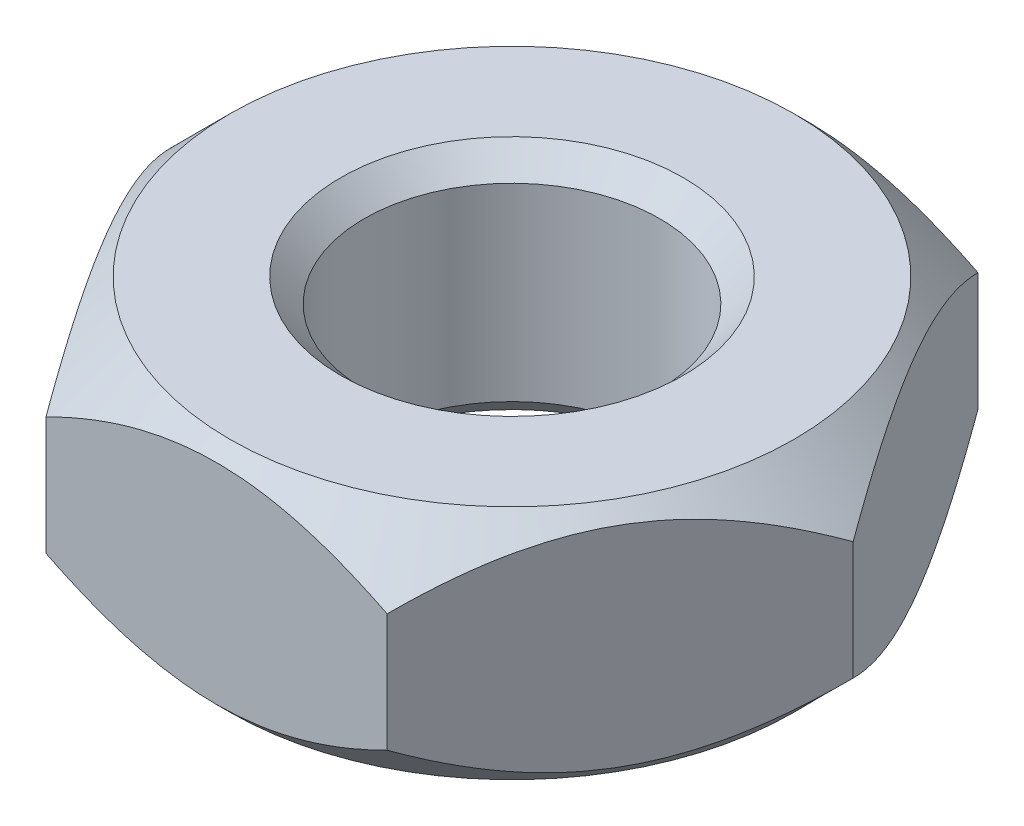
ISO-10303-21;
HEADER;
FILE_DESCRIPTION(('STEP AP214'),'2;1');
FILE_NAME('part.step','',(''),(''),'','','');
FILE_SCHEMA(('AUTOMOTIVE_DESIGN { 1 0 10303 214 1 1 1 1 }'));
ENDSEC;
DATA;
#1=APPLICATION_CONTEXT('core data for automotive mechanical design processes');
#2=APPLICATION_PROTOCOL_DEFINITION('international standard','automotive_design',2000,#1);
#3=PRODUCT_CONTEXT('',#1,'mechanical');
#4=PRODUCT('Part','Part','',(#3));
#5=PRODUCT_RELATED_PRODUCT_CATEGORY('part','',(#4));
#6=PRODUCT_DEFINITION_FORMATION('','',#4);
#7=PRODUCT_DEFINITION_CONTEXT('part definition',#1,'design');
#8=PRODUCT_DEFINITION('design','',#6,#7);
#9=PRODUCT_DEFINITION_SHAPE('','',#8);
#10=(LENGTH_UNIT() NAMED_UNIT(*) SI_UNIT(.MILLI.,.METRE.));
#11=(NAMED_UNIT(*) PLANE_ANGLE_UNIT() SI_UNIT($,.RADIAN.));
#12=(NAMED_UNIT(*) SI_UNIT($,.STERADIAN.) SOLID_ANGLE_UNIT());
#13=UNCERTAINTY_MEASURE_WITH_UNIT(LENGTH_MEASURE(1.E-05),#10,'distance_accuracy_value','');
#14=(GEOMETRIC_REPRESENTATION_CONTEXT(3) GLOBAL_UNCERTAINTY_ASSIGNED_CONTEXT((#13)) GLOBAL_UNIT_ASSIGNED_CONTEXT((#10,
#11,#12)) REPRESENTATION_CONTEXT('',''));
#15=CARTESIAN_POINT('',(0.,0.,0.));
#16=DIRECTION('',(0.,0.,1.));
#17=DIRECTION('',(1.,0.,0.));
#18=AXIS2_PLACEMENT_3D('',#15,#16,#17);
#19=CARTESIAN_POINT('',(-2.88675134594814,-2.,0.));
#20=DIRECTION('',(-0.86602540378444,0.,-0.499999999999998));
#21=DIRECTION('',(-0.499999999999998,0.,0.86602540378444));
#22=AXIS2_PLACEMENT_3D('',#19,#20,#21);
#23=PLANE('',#22);
#24=CARTESIAN_POINT('',(-2.88686681600197,-1.49988452301824,0.000200000000016922));
#25=CARTESIAN_POINT('',(-2.83725032818751,-1.54945929464527,-0.0857382777877483));
#26=CARTESIAN_POINT('',(-2.7868041812811,-1.59612251863749,-0.173113567275737));
#27=CARTESIAN_POINT('',(-2.68393890266961,-1.6815618599617,-0.351281456165573));
#28=CARTESIAN_POINT('',(-2.63150998769861,-1.720290437594,-0.44209100068106));
#29=CARTESIAN_POINT('',(-2.52578957716234,-1.78663329610227,-0.625204123126907));
#30=CARTESIAN_POINT('',(-2.47252500720905,-1.81441433146915,-0.717461064529327));
#31=CARTESIAN_POINT('',(-2.36482323343211,-1.85721682408934,-0.904006008776274));
#32=CARTESIAN_POINT('',(-2.31038931995913,-1.87227023332866,-0.998288312566272));
#33=CARTESIAN_POINT('',(-2.21657570605387,-1.88585227779052,-1.16077825829183));
#34=CARTESIAN_POINT('',(-2.17731721011879,-1.8878629007592,-1.22877596788014));
#35=CARTESIAN_POINT('',(-2.09886438835671,-1.88447588281252,-1.36466024116921));
#36=CARTESIAN_POINT('',(-2.05967008984863,-1.87907564470019,-1.43254675755223));
#37=CARTESIAN_POINT('',(-1.98165157555716,-1.86117421159754,-1.56767878823609));
#38=CARTESIAN_POINT('',(-1.94282782326098,-1.84866507295353,-1.63492349975355));
#39=CARTESIAN_POINT('',(-1.86585167424617,-1.8172324980443,-1.76825010081819));
#40=CARTESIAN_POINT('',(-1.82769922629679,-1.79830955350319,-1.83433207909964));
#41=CARTESIAN_POINT('',(-1.72997445583859,-1.74213263859176,-2.00359634669125));
#42=CARTESIAN_POINT('',(-1.67100807039232,-1.70064416840382,-2.10572912222288));
#43=CARTESIAN_POINT('',(-1.58430317001563,-1.63060595327692,-2.2559064149405));
#44=CARTESIAN_POINT('',(-1.55573003305808,-1.60599774788393,-2.30539653988261));
#45=CARTESIAN_POINT('',(-1.49911303110426,-1.55453811328477,-2.40346006383884));
#46=CARTESIAN_POINT('',(-1.47106885396707,-1.52768806122065,-2.45203400349693));
#47=CARTESIAN_POINT('',(-1.44326020292023,-1.49988452301824,-2.5002));
#48=B_SPLINE_CURVE_WITH_KNOTS('',3,(#24,#25,#26,#27,#28,#29,#30,#31,#32,#33,#34,#35,#36,#37,#38,
#39,#40,#41,#42,#43,#44,#45,#46,#47),.UNSPECIFIED.,.F.,.F.,(4,2,2,2,2,2,2,2,2,2,2,4),(0.,
0.333012085133926,0.6679645183014,0.997597032043304,1.32639954393845,1.56169424147169,
1.79707142102083,2.03271213522171,2.26833478775651,2.64260240809534,2.82922877818865,
3.01574133749027),.UNSPECIFIED.);
#49=CARTESIAN_POINT('',(-2.88675134594814,-1.5,0.));
#50=VERTEX_POINT('',#49);
#51=CARTESIAN_POINT('',(-1.44337567297408,-1.5,-2.5));
#52=VERTEX_POINT('',#51);
#53=EDGE_CURVE('E153',#50,#52,#48,.T.);
#54=ORIENTED_EDGE('',*,*,#53,.F.);
#55=DIRECTION('',(0.,1.,0.));
#56=VECTOR('',#55,1.);
#57=CARTESIAN_POINT('',(-2.88675134594814,-2.,0.));
#58=LINE('',#57,#56);
#59=CARTESIAN_POINT('',(-2.88675134594814,-0.5,0.));
#60=VERTEX_POINT('',#59);
#61=EDGE_CURVE('E52',#50,#60,#58,.T.);
#62=ORIENTED_EDGE('',*,*,#61,.T.);
#63=CARTESIAN_POINT('',(-1.44326020292023,-0.50011547698176,-2.5002));
#64=CARTESIAN_POINT('',(-1.49287669073469,-0.450540705354723,-2.41426172221224));
#65=CARTESIAN_POINT('',(-1.5433228376411,-0.403877481362501,-2.32688643272425));
#66=CARTESIAN_POINT('',(-1.64618811625259,-0.318438140038296,-2.14871854383441));
#67=CARTESIAN_POINT('',(-1.6986170312236,-0.279709562405997,-2.05790899931892));
#68=CARTESIAN_POINT('',(-1.80433744175986,-0.213366703897733,-1.87479587687308));
#69=CARTESIAN_POINT('',(-1.85760201171316,-0.185585668530851,-1.78253893547066));
#70=CARTESIAN_POINT('',(-1.9653037854901,-0.14278317591066,-1.59599399122371));
#71=CARTESIAN_POINT('',(-2.01973769896307,-0.127729766671338,-1.50171168743372));
#72=CARTESIAN_POINT('',(-2.11355131286833,-0.114147722209475,-1.33922174170815));
#73=CARTESIAN_POINT('',(-2.15280980880341,-0.112137099240795,-1.27122403211985));
#74=CARTESIAN_POINT('',(-2.23126263056549,-0.115524117187482,-1.13533975883078));
#75=CARTESIAN_POINT('',(-2.27045692907358,-0.120924355299814,-1.06745324244776));
#76=CARTESIAN_POINT('',(-2.34847544336505,-0.138825788402465,-0.932321211763894));
#77=CARTESIAN_POINT('',(-2.38729919566123,-0.151334927046473,-0.865076500246439));
#78=CARTESIAN_POINT('',(-2.46427534467603,-0.182767501955699,-0.731749899181801));
#79=CARTESIAN_POINT('',(-2.50242779262542,-0.201690446496811,-0.665667920900343));
#80=CARTESIAN_POINT('',(-2.60015256308362,-0.25786736140824,-0.496403653308732));
#81=CARTESIAN_POINT('',(-2.65911894852989,-0.299355831596181,-0.394270877777102));
#82=CARTESIAN_POINT('',(-2.74582384890657,-0.369394046723084,-0.244093585059482));
#83=CARTESIAN_POINT('',(-2.77439698586412,-0.39400225211607,-0.19460346011738));
#84=CARTESIAN_POINT('',(-2.83101398781794,-0.445461886715234,-0.0965399361611392));
#85=CARTESIAN_POINT('',(-2.85905816495514,-0.472311938779355,-0.0479659965030565));
#86=CARTESIAN_POINT('',(-2.88686681600197,-0.500115476981764,0.00020000000001703));
#87=B_SPLINE_CURVE_WITH_KNOTS('',3,(#63,#64,#65,#66,#67,#68,#69,#70,#71,#72,#73,#74,#75,#76,#77,
#78,#79,#80,#81,#82,#83,#84,#85,#86),.UNSPECIFIED.,.F.,.F.,(4,2,2,2,2,2,2,2,2,2,2,4),(0.,
0.333012085133924,0.667964518301398,0.9975970320433,1.32639954393844,1.56169424147169,
1.79707142102083,2.03271213522171,2.2683347877565,2.64260240809534,2.82922877818865,
3.01574133749027),.UNSPECIFIED.);
#88=CARTESIAN_POINT('',(-1.44337567297408,-0.5,-2.5));
#89=VERTEX_POINT('',#88);
#90=EDGE_CURVE('E112',#89,#60,#87,.T.);
#91=ORIENTED_EDGE('',*,*,#90,.F.);
#92=DIRECTION('',(0.,1.,0.));
#93=VECTOR('',#92,1.);
#94=CARTESIAN_POINT('',(-1.44337567297407,-2.,-2.5));
#95=LINE('',#94,#93);
#96=EDGE_CURVE('E117',#52,#89,#95,.T.);
#97=ORIENTED_EDGE('',*,*,#96,.F.);
#98=EDGE_LOOP('',(#54,#62,#91,#97));
#99=FACE_BOUND('',#98,.T.);
#100=ADVANCED_FACE('F29',(#99),#23,.T.);
#101=CARTESIAN_POINT('',(-1.44337567297407,-2.,-2.5));
#102=DIRECTION('',(0.,0.,-1.));
#103=DIRECTION('',(-1.,0.,0.));
#104=AXIS2_PLACEMENT_3D('',#101,#102,#103);
#105=PLANE('',#104);
#106=CARTESIAN_POINT('',(-2.96668433955213,-0.50716168072014,-2.5));
#107=CARTESIAN_POINT('',(-2.8948317096725,-0.562094291020301,-2.5));
#108=CARTESIAN_POINT('',(-2.82258679707706,-0.616521949176977,-2.5));
#109=CARTESIAN_POINT('',(-2.67715393829106,-0.724138208465676,-2.5));
#110=CARTESIAN_POINT('',(-2.60396576868744,-0.777326507352796,-2.5));
#111=CARTESIAN_POINT('',(-2.45595268046653,-0.882613460257373,-2.5));
#112=CARTESIAN_POINT('',(-2.38111948346967,-0.93470051499951,-2.5));
#113=CARTESIAN_POINT('',(-2.2301989653448,-1.03701874636586,-2.5));
#114=CARTESIAN_POINT('',(-2.15411173180744,-1.08725005182076,-2.5));
#115=CARTESIAN_POINT('',(-1.9957576137183,-1.18845284780402,-2.5));
#116=CARTESIAN_POINT('',(-1.91339821044008,-1.23928030245024,-2.5));
#117=CARTESIAN_POINT('',(-1.74677292530007,-1.33770298399123,-2.5));
#118=CARTESIAN_POINT('',(-1.6625072948511,-1.38529863385422,-2.5));
#119=CARTESIAN_POINT('',(-1.49202090628762,-1.4762629104708,-2.5));
#120=CARTESIAN_POINT('',(-1.4058065139511,-1.51964337466806,-2.5));
#121=CARTESIAN_POINT('',(-1.23096887512707,-1.60119760358206,-2.5));
#122=CARTESIAN_POINT('',(-1.14234677306194,-1.63937379178838,-2.5));
#123=CARTESIAN_POINT('',(-0.970857842618479,-1.70590877597029,-2.5));
#124=CARTESIAN_POINT('',(-0.888219170351425,-1.73484961454076,-2.5));
#125=CARTESIAN_POINT('',(-0.720875298126575,-1.78611226326244,-2.5));
#126=CARTESIAN_POINT('',(-0.63616996352977,-1.80843364091585,-2.5));
#127=CARTESIAN_POINT('',(-0.466650942448528,-1.84489217896014,-2.5));
#128=CARTESIAN_POINT('',(-0.381869134653481,-1.85917509778603,-2.5));
#129=CARTESIAN_POINT('',(-0.211301742264057,-1.87926536158531,-2.5));
#130=CARTESIAN_POINT('',(-0.12551635652182,-1.8850743578689,-2.5));
#131=CARTESIAN_POINT('',(0.0426703656744015,-1.88774325465857,-2.5));
#132=CARTESIAN_POINT('',(0.125066107632572,-1.88496061689089,-2.5));
#133=CARTESIAN_POINT('',(0.289193381610066,-1.87141033229845,-2.5));
#134=CARTESIAN_POINT('',(0.370924851074756,-1.86064194206392,-2.5));
#135=CARTESIAN_POINT('',(0.534518605306853,-1.83153951160601,-2.5));
#136=CARTESIAN_POINT('',(0.616357066153045,-1.81307355324132,-2.5));
#137=CARTESIAN_POINT('',(0.778230408567287,-1.76958390685987,-2.5));
#138=CARTESIAN_POINT('',(0.858265409015181,-1.74456065246594,-2.5));
#139=CARTESIAN_POINT('',(1.10640142051369,-1.65746767285976,-2.5));
#140=CARTESIAN_POINT('',(1.27108970475707,-1.58564168301095,-2.5));
#141=CARTESIAN_POINT('',(1.51211013995076,-1.46585710596878,-2.5));
#142=CARTESIAN_POINT('',(1.59159684007466,-1.42382785957348,-2.5));
#143=CARTESIAN_POINT('',(1.74876895904319,-1.3365189493186,-2.5));
#144=CARTESIAN_POINT('',(1.82645469386736,-1.29123986144223,-2.5));
#145=CARTESIAN_POINT('',(1.97643122124162,-1.20038955470845,-2.5));
#146=CARTESIAN_POINT('',(2.04879877304284,-1.15494361847622,-2.5));
#147=CARTESIAN_POINT('',(2.19229239644035,-1.06212297540419,-2.5));
#148=CARTESIAN_POINT('',(2.26341837406328,-1.01474812346353,-2.5));
#149=CARTESIAN_POINT('',(2.40401606758878,-0.918802509104789,-2.5));
#150=CARTESIAN_POINT('',(2.47349649538698,-0.870244460069756,-2.5));
#151=CARTESIAN_POINT('',(2.6115052188232,-0.771831837624504,-2.5));
#152=CARTESIAN_POINT('',(2.6800337715094,-0.72197762510584,-2.5));
#153=CARTESIAN_POINT('',(2.74816343524428,-0.671592901572763,-2.5));
#154=B_SPLINE_CURVE_WITH_KNOTS('',3,(#106,#107,#108,#109,#110,#111,#112,#113,#114,#115,#116,
#117,#118,#119,#120,#121,#122,#123,#124,#125,#126,#127,#128,#129,#130,#131,#132,#133,#134,#135,
#136,#137,#138,#139,#140,#141,#142,#143,#144,#145,#146,#147,#148,#149,#150,#151,#152,#153),
.UNSPECIFIED.,.F.,.F.,(4,2,2,2,2,2,2,2,2,2,2,2,2,2,2,2,2,2,2,2,2,2,2,4),(0.,0.271341667855833,
0.542748830046722,0.816253709161615,1.08973956507595,1.38002315639178,1.67026868280413,
1.95967401363601,2.24894411253436,2.51139576932094,2.77386457021757,3.0314066607157,
3.28889855737335,3.53582375183444,3.78277193594476,4.03413854269895,4.28548853120069,
4.82282938730673,5.09254998785806,5.36222290216635,5.61855395261542,5.87490432107986,
6.12918893681202,6.38340349453403),.UNSPECIFIED.);
#155=CARTESIAN_POINT('',(1.44337567297408,-1.5,-2.5));
#156=VERTEX_POINT('',#155);
#157=EDGE_CURVE('E158',#52,#156,#154,.T.);
#158=ORIENTED_EDGE('',*,*,#157,.F.);
#159=ORIENTED_EDGE('',*,*,#96,.T.);
#160=CARTESIAN_POINT('',(-2.96668433955213,-1.49283831927986,-2.5));
#161=CARTESIAN_POINT('',(-2.8948317096725,-1.4379057089797,-2.5));
#162=CARTESIAN_POINT('',(-2.82258679707706,-1.38347805082302,-2.5));
#163=CARTESIAN_POINT('',(-2.67715393829106,-1.27586179153432,-2.5));
#164=CARTESIAN_POINT('',(-2.60396576868744,-1.2226734926472,-2.5));
#165=CARTESIAN_POINT('',(-2.45595268046653,-1.11738653974263,-2.5));
#166=CARTESIAN_POINT('',(-2.38111948346967,-1.06529948500049,-2.5));
#167=CARTESIAN_POINT('',(-2.2301989653448,-0.962981253634143,-2.5));
#168=CARTESIAN_POINT('',(-2.15411173180744,-0.91274994817924,-2.5));
#169=CARTESIAN_POINT('',(-1.9957576137183,-0.811547152195981,-2.5));
#170=CARTESIAN_POINT('',(-1.91339821044008,-0.76071969754976,-2.5));
#171=CARTESIAN_POINT('',(-1.74677292530007,-0.662297016008771,-2.5));
#172=CARTESIAN_POINT('',(-1.6625072948511,-0.61470136614578,-2.5));
#173=CARTESIAN_POINT('',(-1.49202090628762,-0.523737089529204,-2.5));
#174=CARTESIAN_POINT('',(-1.4058065139511,-0.480356625331944,-2.5));
#175=CARTESIAN_POINT('',(-1.23096887512707,-0.398802396417942,-2.5));
#176=CARTESIAN_POINT('',(-1.14234677306194,-0.36062620821162,-2.5));
#177=CARTESIAN_POINT('',(-0.970857842618479,-0.29409122402971,-2.5));
#178=CARTESIAN_POINT('',(-0.888219170351425,-0.265150385459239,-2.5));
#179=CARTESIAN_POINT('',(-0.720875298126575,-0.213887736737561,-2.5));
#180=CARTESIAN_POINT('',(-0.63616996352977,-0.191566359084148,-2.5));
#181=CARTESIAN_POINT('',(-0.466650942448528,-0.155107821039862,-2.5));
#182=CARTESIAN_POINT('',(-0.38186913465348,-0.140824902213974,-2.5));
#183=CARTESIAN_POINT('',(-0.211301742264056,-0.12073463841469,-2.5));
#184=CARTESIAN_POINT('',(-0.125516356521819,-0.114925642131103,-2.5));
#185=CARTESIAN_POINT('',(0.0426703656744026,-0.112256745341427,-2.5));
#186=CARTESIAN_POINT('',(0.125066107632573,-0.115039383109113,-2.5));
#187=CARTESIAN_POINT('',(0.289193381610067,-0.128589667701554,-2.5));
#188=CARTESIAN_POINT('',(0.370924851074757,-0.139358057936075,-2.5));
#189=CARTESIAN_POINT('',(0.534518605306854,-0.168460488393988,-2.5));
#190=CARTESIAN_POINT('',(0.616357066153047,-0.186926446758684,-2.5));
#191=CARTESIAN_POINT('',(0.778230408567288,-0.230416093140128,-2.5));
#192=CARTESIAN_POINT('',(0.858265409015182,-0.255439347534065,-2.5));
#193=CARTESIAN_POINT('',(1.10640142051369,-0.342532327140244,-2.5));
#194=CARTESIAN_POINT('',(1.27108970475708,-0.414358316989049,-2.5));
#195=CARTESIAN_POINT('',(1.51211013995076,-0.534142894031226,-2.5));
#196=CARTESIAN_POINT('',(1.59159684007467,-0.576172140426518,-2.5));
#197=CARTESIAN_POINT('',(1.74876895904319,-0.663481050681403,-2.5));
#198=CARTESIAN_POINT('',(1.82645469386736,-0.708760138557776,-2.5));
#199=CARTESIAN_POINT('',(1.97643122124163,-0.799610445291555,-2.5));
#200=CARTESIAN_POINT('',(2.04879877304285,-0.845056381523783,-2.5));
#201=CARTESIAN_POINT('',(2.19229239644036,-0.937877024595809,-2.5));
#202=CARTESIAN_POINT('',(2.26341837406328,-0.98525187653647,-2.5));
#203=CARTESIAN_POINT('',(2.40401606758878,-1.08119749089521,-2.5));
#204=CARTESIAN_POINT('',(2.47349649538698,-1.12975553993025,-2.5));
#205=CARTESIAN_POINT('',(2.61150521882321,-1.2281681623755,-2.5));
#206=CARTESIAN_POINT('',(2.6800337715094,-1.27802237489416,-2.5));
#207=CARTESIAN_POINT('',(2.74816343524428,-1.32840709842724,-2.5));
#208=B_SPLINE_CURVE_WITH_KNOTS('',3,(#160,#161,#162,#163,#164,#165,#166,#167,#168,#169,#170,
#171,#172,#173,#174,#175,#176,#177,#178,#179,#180,#181,#182,#183,#184,#185,#186,#187,#188,#189,
#190,#191,#192,#193,#194,#195,#196,#197,#198,#199,#200,#201,#202,#203,#204,#205,#206,#207),
.UNSPECIFIED.,.F.,.F.,(4,2,2,2,2,2,2,2,2,2,2,2,2,2,2,2,2,2,2,2,2,2,2,4),(0.,0.271341667855833,
0.542748830046723,0.816253709161615,1.08973956507595,1.38002315639178,1.67026868280413,
1.95967401363601,2.24894411253436,2.51139576932094,2.77386457021757,3.0314066607157,
3.28889855737335,3.53582375183444,3.78277193594476,4.03413854269895,4.28548853120069,
4.82282938730673,5.09254998785806,5.36222290216635,5.61855395261542,5.87490432107986,
6.12918893681203,6.38340349453404),.UNSPECIFIED.);
#209=CARTESIAN_POINT('',(1.44337567297408,-0.5,-2.5));
#210=VERTEX_POINT('',#209);
#211=EDGE_CURVE('E198',#210,#89,#208,.F.);
#212=ORIENTED_EDGE('',*,*,#211,.F.);
#213=DIRECTION('',(0.,1.,0.));
#214=VECTOR('',#213,1.);
#215=CARTESIAN_POINT('',(1.44337567297408,-2.,-2.5));
#216=LINE('',#215,#214);
#217=EDGE_CURVE('E106',#156,#210,#216,.T.);
#218=ORIENTED_EDGE('',*,*,#217,.F.);
#219=EDGE_LOOP('',(#158,#159,#212,#218));
#220=FACE_BOUND('',#219,.T.);
#221=ADVANCED_FACE('F208',(#220),#105,.T.);
#222=CARTESIAN_POINT('',(1.44337567297408,-2.,-2.5));
#223=DIRECTION('',(0.866025403784441,0.,-0.499999999999997));
#224=DIRECTION('',(-0.499999999999997,0.,-0.866025403784441));
#225=AXIS2_PLACEMENT_3D('',#222,#223,#224);
#226=PLANE('',#225);
#227=CARTESIAN_POINT('',(1.44326020292024,-1.49988452301823,-2.5002));
#228=CARTESIAN_POINT('',(1.4928766907347,-1.54945929464527,-2.41426172221224));
#229=CARTESIAN_POINT('',(1.54332283764111,-1.59612251863749,-2.32688643272425));
#230=CARTESIAN_POINT('',(1.6461881162526,-1.6815618599617,-2.14871854383441));
#231=CARTESIAN_POINT('',(1.6986170312236,-1.720290437594,-2.05790899931893));
#232=CARTESIAN_POINT('',(1.80433744175987,-1.78663329610226,-1.87479587687308));
#233=CARTESIAN_POINT('',(1.85760201171316,-1.81441433146914,-1.78253893547066));
#234=CARTESIAN_POINT('',(1.9653037854901,-1.85721682408934,-1.59599399122371));
#235=CARTESIAN_POINT('',(2.01973769896307,-1.87227023332866,-1.50171168743372));
#236=CARTESIAN_POINT('',(2.11355131286833,-1.88585227779052,-1.33922174170815));
#237=CARTESIAN_POINT('',(2.15280980880342,-1.8878629007592,-1.27122403211985));
#238=CARTESIAN_POINT('',(2.2312626305655,-1.88447588281251,-1.13533975883078));
#239=CARTESIAN_POINT('',(2.27045692907358,-1.87907564470018,-1.06745324244776));
#240=CARTESIAN_POINT('',(2.34847544336505,-1.86117421159753,-0.932321211763894));
#241=CARTESIAN_POINT('',(2.38729919566123,-1.84866507295352,-0.865076500246439));
#242=CARTESIAN_POINT('',(2.46427534467604,-1.8172324980443,-0.731749899181801));
#243=CARTESIAN_POINT('',(2.50242779262542,-1.79830955350319,-0.665667920900343));
#244=CARTESIAN_POINT('',(2.60015256308362,-1.74213263859176,-0.496403653308734));
#245=CARTESIAN_POINT('',(2.65911894852989,-1.70064416840382,-0.394270877777104));
#246=CARTESIAN_POINT('',(2.74582384890657,-1.63060595327692,-0.244093585059486));
#247=CARTESIAN_POINT('',(2.77439698586412,-1.60599774788393,-0.194603460117385));
#248=CARTESIAN_POINT('',(2.83101398781794,-1.55453811328477,-0.0965399361611462));
#249=CARTESIAN_POINT('',(2.85905816495514,-1.52768806122065,-0.0479659965030644));
#250=CARTESIAN_POINT('',(2.88686681600197,-1.49988452301824,0.000200000000008444));
#251=B_SPLINE_CURVE_WITH_KNOTS('',3,(#227,#228,#229,#230,#231,#232,#233,#234,#235,#236,#237,
#238,#239,#240,#241,#242,#243,#244,#245,#246,#247,#248,#249,#250),.UNSPECIFIED.,.F.,.F.,(4,2,2,
2,2,2,2,2,2,2,2,4),(0.,0.333012085133924,0.667964518301397,0.997597032043299,1.32639954393844,
1.56169424147169,1.79707142102083,2.03271213522171,2.2683347877565,2.64260240809533,
2.82922877818864,3.01574133749025),.UNSPECIFIED.);
#252=CARTESIAN_POINT('',(2.88675134594814,-1.5,0.));
#253=VERTEX_POINT('',#252);
#254=EDGE_CURVE('E86',#156,#253,#251,.T.);
#255=ORIENTED_EDGE('',*,*,#254,.F.);
#256=ORIENTED_EDGE('',*,*,#217,.T.);
#257=CARTESIAN_POINT('',(2.88686681600197,-0.500115476981762,0.000200000000008917));
#258=CARTESIAN_POINT('',(2.83725032818751,-0.450540705354725,-0.085738277787756));
#259=CARTESIAN_POINT('',(2.7868041812811,-0.403877481362504,-0.173113567275744));
#260=CARTESIAN_POINT('',(2.68393890266961,-0.318438140038299,-0.351281456165579));
#261=CARTESIAN_POINT('',(2.63150998769861,-0.279709562406,-0.442091000681066));
#262=CARTESIAN_POINT('',(2.52578957716235,-0.213366703897736,-0.625204123126912));
#263=CARTESIAN_POINT('',(2.47252500720905,-0.185585668530854,-0.717461064529331));
#264=CARTESIAN_POINT('',(2.36482323343211,-0.142783175910664,-0.904006008776276));
#265=CARTESIAN_POINT('',(2.31038931995914,-0.127729766671342,-0.998288312566273));
#266=CARTESIAN_POINT('',(2.21657570605388,-0.11414772220948,-1.16077825829184));
#267=CARTESIAN_POINT('',(2.17731721011879,-0.112137099240799,-1.22877596788014));
#268=CARTESIAN_POINT('',(2.09886438835671,-0.115524117187486,-1.36466024116921));
#269=CARTESIAN_POINT('',(2.05967008984863,-0.120924355299818,-1.43254675755223));
#270=CARTESIAN_POINT('',(1.98165157555716,-0.138825788402469,-1.5676787882361));
#271=CARTESIAN_POINT('',(1.94282782326098,-0.151334927046478,-1.63492349975355));
#272=CARTESIAN_POINT('',(1.86585167424617,-0.182767501955704,-1.76825010081819));
#273=CARTESIAN_POINT('',(1.82769922629679,-0.201690446496815,-1.83433207909965));
#274=CARTESIAN_POINT('',(1.72997445583859,-0.257867361408244,-2.00359634669126));
#275=CARTESIAN_POINT('',(1.67100807039232,-0.299355831596184,-2.10572912222289));
#276=CARTESIAN_POINT('',(1.58430317001564,-0.369394046723086,-2.25590641494051));
#277=CARTESIAN_POINT('',(1.55573003305809,-0.394002252116073,-2.30539653988261));
#278=CARTESIAN_POINT('',(1.49911303110427,-0.445461886715235,-2.40346006383885));
#279=CARTESIAN_POINT('',(1.47106885396707,-0.472311938779356,-2.45203400349693));
#280=CARTESIAN_POINT('',(1.44326020292024,-0.500115476981764,-2.5002));
#281=B_SPLINE_CURVE_WITH_KNOTS('',3,(#257,#258,#259,#260,#261,#262,#263,#264,#265,#266,#267,
#268,#269,#270,#271,#272,#273,#274,#275,#276,#277,#278,#279,#280),.UNSPECIFIED.,.F.,.F.,(4,2,2,
2,2,2,2,2,2,2,2,4),(0.,0.333012085133923,0.667964518301396,0.997597032043296,1.32639954393844,
1.56169424147168,1.79707142102082,2.0327121352217,2.2683347877565,2.64260240809533,
2.82922877818864,3.01574133749025),.UNSPECIFIED.);
#282=CARTESIAN_POINT('',(2.88675134594814,-0.5,0.));
#283=VERTEX_POINT('',#282);
#284=EDGE_CURVE('E192',#283,#210,#281,.T.);
#285=ORIENTED_EDGE('',*,*,#284,.F.);
#286=DIRECTION('',(0.,1.,0.));
#287=VECTOR('',#286,1.);
#288=CARTESIAN_POINT('',(2.88675134594813,-2.,0.));
#289=LINE('',#288,#287);
#290=EDGE_CURVE('E104',#253,#283,#289,.T.);
#291=ORIENTED_EDGE('',*,*,#290,.F.);
#292=EDGE_LOOP('',(#255,#256,#285,#291));
#293=FACE_BOUND('',#292,.T.);
#294=ADVANCED_FACE('F212',(#293),#226,.T.);
#295=CARTESIAN_POINT('',(2.88675134594813,-2.,0.));
#296=DIRECTION('',(0.866025403784436,0.,0.500000000000005));
#297=DIRECTION('',(0.500000000000005,0.,-0.866025403784436));
#298=AXIS2_PLACEMENT_3D('',#295,#296,#297);
#299=PLANE('',#298);
#300=CARTESIAN_POINT('',(2.88686681600197,-1.49988452301824,-0.000199999999991391));
#301=CARTESIAN_POINT('',(2.83725032818751,-1.54945929464528,0.0857382777877732));
#302=CARTESIAN_POINT('',(2.7868041812811,-1.5961225186375,0.173113567275761));
#303=CARTESIAN_POINT('',(2.6839389026696,-1.6815618599617,0.351281456165597));
#304=CARTESIAN_POINT('',(2.6315099876986,-1.720290437594,0.442091000681082));
#305=CARTESIAN_POINT('',(2.52578957716234,-1.78663329610227,0.625204123126928));
#306=CARTESIAN_POINT('',(2.47252500720904,-1.81441433146915,0.717461064529348));
#307=CARTESIAN_POINT('',(2.3648232334321,-1.85721682408934,0.904006008776293));
#308=CARTESIAN_POINT('',(2.31038931995913,-1.87227023332866,0.99828831256629));
#309=CARTESIAN_POINT('',(2.21657570605386,-1.88585227779053,1.16077825829185));
#310=CARTESIAN_POINT('',(2.17731721011878,-1.88786290075921,1.22877596788016));
#311=CARTESIAN_POINT('',(2.0988643883567,-1.88447588281252,1.36466024116922));
#312=CARTESIAN_POINT('',(2.05967008984861,-1.87907564470019,1.43254675755224));
#313=CARTESIAN_POINT('',(1.98165157555714,-1.86117421159754,1.56767878823611));
#314=CARTESIAN_POINT('',(1.94282782326096,-1.84866507295353,1.63492349975356));
#315=CARTESIAN_POINT('',(1.86585167424615,-1.8172324980443,1.7682501008182));
#316=CARTESIAN_POINT('',(1.82769922629677,-1.79830955350319,1.83433207909966));
#317=CARTESIAN_POINT('',(1.72997445583857,-1.74213263859176,2.00359634669126));
#318=CARTESIAN_POINT('',(1.6710080703923,-1.70064416840382,2.10572912222289));
#319=CARTESIAN_POINT('',(1.58430317001561,-1.63060595327692,2.25590641494051));
#320=CARTESIAN_POINT('',(1.55573003305806,-1.60599774788394,2.30539653988261));
#321=CARTESIAN_POINT('',(1.49911303110425,-1.55453811328478,2.40346006383885));
#322=CARTESIAN_POINT('',(1.47106885396705,-1.52768806122065,2.45203400349693));
#323=CARTESIAN_POINT('',(1.44326020292022,-1.49988452301825,2.5002));
#324=B_SPLINE_CURVE_WITH_KNOTS('',3,(#300,#301,#302,#303,#304,#305,#306,#307,#308,#309,#310,
#311,#312,#313,#314,#315,#316,#317,#318,#319,#320,#321,#322,#323),.UNSPECIFIED.,.F.,.F.,(4,2,2,
2,2,2,2,2,2,2,2,4),(0.,0.333012085133925,0.667964518301399,0.997597032043302,1.32639954393845,
1.56169424147169,1.79707142102083,2.03271213522171,2.2683347877565,2.64260240809533,
2.82922877818864,3.01574133749025),.UNSPECIFIED.);
#325=CARTESIAN_POINT('',(1.44337567297408,-1.5,2.5));
#326=VERTEX_POINT('',#325);
#327=EDGE_CURVE('E82',#253,#326,#324,.T.);
#328=ORIENTED_EDGE('',*,*,#327,.F.);
#329=ORIENTED_EDGE('',*,*,#290,.T.);
#330=CARTESIAN_POINT('',(1.44326020292022,-0.500115476981753,2.5002));
#331=CARTESIAN_POINT('',(1.49287669073468,-0.450540705354716,2.41426172221224));
#332=CARTESIAN_POINT('',(1.54332283764109,-0.403877481362495,2.32688643272425));
#333=CARTESIAN_POINT('',(1.64618811625258,-0.318438140038292,2.14871854383442));
#334=CARTESIAN_POINT('',(1.69861703122358,-0.279709562405993,2.05790899931893));
#335=CARTESIAN_POINT('',(1.80433744175985,-0.21336670389773,1.87479587687309));
#336=CARTESIAN_POINT('',(1.85760201171315,-0.185585668530848,1.78253893547067));
#337=CARTESIAN_POINT('',(1.96530378549008,-0.142783175910658,1.59599399122373));
#338=CARTESIAN_POINT('',(2.01973769896306,-0.127729766671336,1.50171168743373));
#339=CARTESIAN_POINT('',(2.11355131286832,-0.114147722209474,1.33922174170817));
#340=CARTESIAN_POINT('',(2.1528098088034,-0.112137099240794,1.27122403211986));
#341=CARTESIAN_POINT('',(2.23126263056548,-0.115524117187481,1.1353397588308));
#342=CARTESIAN_POINT('',(2.27045692907357,-0.120924355299813,1.06745324244778));
#343=CARTESIAN_POINT('',(2.34847544336504,-0.138825788402464,0.932321211763912));
#344=CARTESIAN_POINT('',(2.38729919566122,-0.151334927046473,0.865076500246457));
#345=CARTESIAN_POINT('',(2.46427534467603,-0.182767501955699,0.73174989918182));
#346=CARTESIAN_POINT('',(2.50242779262541,-0.20169044649681,0.665667920900362));
#347=CARTESIAN_POINT('',(2.60015256308361,-0.257867361408239,0.496403653308753));
#348=CARTESIAN_POINT('',(2.65911894852988,-0.29935583159618,0.394270877777123));
#349=CARTESIAN_POINT('',(2.74582384890657,-0.369394046723083,0.244093585059504));
#350=CARTESIAN_POINT('',(2.77439698586412,-0.394002252116069,0.194603460117403));
#351=CARTESIAN_POINT('',(2.83101398781794,-0.445461886715232,0.0965399361611634));
#352=CARTESIAN_POINT('',(2.85905816495514,-0.472311938779353,0.0479659965030815));
#353=CARTESIAN_POINT('',(2.88686681600197,-0.500115476981762,-0.000199999999991508));
#354=B_SPLINE_CURVE_WITH_KNOTS('',3,(#330,#331,#332,#333,#334,#335,#336,#337,#338,#339,#340,
#341,#342,#343,#344,#345,#346,#347,#348,#349,#350,#351,#352,#353),.UNSPECIFIED.,.F.,.F.,(4,2,2,
2,2,2,2,2,2,2,2,4),(0.,0.333012085133921,0.667964518301392,0.997597032043291,1.32639954393843,
1.56169424147167,1.79707142102081,2.03271213522169,2.26833478775649,2.64260240809532,
2.82922877818863,3.01574133749025),.UNSPECIFIED.);
#355=CARTESIAN_POINT('',(1.44337567297408,-0.5,2.5));
#356=VERTEX_POINT('',#355);
#357=EDGE_CURVE('E103',#356,#283,#354,.T.);
#358=ORIENTED_EDGE('',*,*,#357,.F.);
#359=DIRECTION('',(0.,1.,0.));
#360=VECTOR('',#359,1.);
#361=CARTESIAN_POINT('',(1.44337567297405,-2.,2.5));
#362=LINE('',#361,#360);
#363=EDGE_CURVE('E95',#326,#356,#362,.T.);
#364=ORIENTED_EDGE('',*,*,#363,.F.);
#365=EDGE_LOOP('',(#328,#329,#358,#364));
#366=FACE_BOUND('',#365,.T.);
#367=ADVANCED_FACE('F101',(#366),#299,.T.);
#368=CARTESIAN_POINT('',(1.44337567297405,-2.,2.5));
#369=DIRECTION('',(0.,0.,1.));
#370=DIRECTION('',(1.,0.,0.));
#371=AXIS2_PLACEMENT_3D('',#368,#369,#370);
#372=PLANE('',#371);
#373=CARTESIAN_POINT('',(-2.96668433956989,-0.507161680706556,2.5));
#374=CARTESIAN_POINT('',(-2.89483170968975,-0.562094291007242,2.5));
#375=CARTESIAN_POINT('',(-2.8225867970938,-0.616521949164443,2.5));
#376=CARTESIAN_POINT('',(-2.67715393830678,-0.724138208454188,2.5));
#377=CARTESIAN_POINT('',(-2.60396576870264,-0.777326507341829,2.5));
#378=CARTESIAN_POINT('',(-2.45595268048069,-0.882613460247453,2.5));
#379=CARTESIAN_POINT('',(-2.38111948348329,-0.934700514990116,2.5));
#380=CARTESIAN_POINT('',(-2.23019896535735,-1.0370187463575,2.5));
#381=CARTESIAN_POINT('',(-2.15411173181945,-1.08725005181292,2.5));
#382=CARTESIAN_POINT('',(-1.99575761372914,-1.18845284779726,2.5));
#383=CARTESIAN_POINT('',(-1.91339821045029,-1.23928030244404,2.5));
#384=CARTESIAN_POINT('',(-1.74677292530901,-1.33770298398612,2.5));
#385=CARTESIAN_POINT('',(-1.66250729485939,-1.38529863384964,2.5));
#386=CARTESIAN_POINT('',(-1.49202090629458,-1.47626291046724,2.5));
#387=CARTESIAN_POINT('',(-1.40580651395739,-1.51964337466499,2.5));
#388=CARTESIAN_POINT('',(-1.23096887513197,-1.60119760357991,2.5));
#389=CARTESIAN_POINT('',(-1.14234677306613,-1.63937379178666,2.5));
#390=CARTESIAN_POINT('',(-0.97085784262237,-1.70590877596887,2.5));
#391=CARTESIAN_POINT('',(-0.888219170355759,-1.7348496145393,2.5));
#392=CARTESIAN_POINT('',(-0.72087529813181,-1.78611226326097,2.5));
#393=CARTESIAN_POINT('',(-0.636169963535464,-1.80843364091443,2.5));
#394=CARTESIAN_POINT('',(-0.466650942455125,-1.84489217895891,2.5));
#395=CARTESIAN_POINT('',(-0.381869134660522,-1.85917509778495,2.5));
#396=CARTESIAN_POINT('',(-0.211301742271974,-1.87926536158463,2.5));
#397=CARTESIAN_POINT('',(-0.125516356530169,-1.88507435786846,2.5));
#398=CARTESIAN_POINT('',(0.0426703656652969,-1.88774325465872,2.5));
#399=CARTESIAN_POINT('',(0.125066107623142,-1.88496061689135,2.5));
#400=CARTESIAN_POINT('',(0.289193381600021,-1.87141033229959,2.5));
#401=CARTESIAN_POINT('',(0.370924851064421,-1.86064194206544,2.5));
#402=CARTESIAN_POINT('',(0.534518605295945,-1.83153951160829,2.5));
#403=CARTESIAN_POINT('',(0.616357066141856,-1.81307355324399,2.5));
#404=CARTESIAN_POINT('',(0.778230408555563,-1.76958390686335,2.5));
#405=CARTESIAN_POINT('',(0.858265409003205,-1.74456065246982,2.5));
#406=CARTESIAN_POINT('',(1.10640142049915,-1.65746767286554,2.5));
#407=CARTESIAN_POINT('',(1.27108970474034,-1.58564168301848,2.5));
#408=CARTESIAN_POINT('',(1.51211013993088,-1.46585710597905,2.5));
#409=CARTESIAN_POINT('',(1.59159684005376,-1.4238278595847,2.5));
#410=CARTESIAN_POINT('',(1.74876895902025,-1.33651894933174,2.5));
#411=CARTESIAN_POINT('',(1.82645469384343,-1.29123986145634,2.5));
#412=CARTESIAN_POINT('',(1.97643122121588,-1.20038955472441,2.5));
#413=CARTESIAN_POINT('',(2.04879877301628,-1.15494361849305,2.5));
#414=CARTESIAN_POINT('',(2.19229239641217,-1.06212297542277,2.5));
#415=CARTESIAN_POINT('',(2.26341837403429,-1.01474812348299,2.5));
#416=CARTESIAN_POINT('',(2.4040160675582,-0.918802509125984,2.5));
#417=CARTESIAN_POINT('',(2.47349649535561,-0.870244460091816,2.5));
#418=CARTESIAN_POINT('',(2.61150521879027,-0.771831837648292,2.5));
#419=CARTESIAN_POINT('',(2.68003377147569,-0.721977625130492,2.5));
#420=CARTESIAN_POINT('',(2.74816343520979,-0.671592901598277,2.5));
#421=B_SPLINE_CURVE_WITH_KNOTS('',3,(#373,#374,#375,#376,#377,#378,#379,#380,#381,#382,#383,
#384,#385,#386,#387,#388,#389,#390,#391,#392,#393,#394,#395,#396,#397,#398,#399,#400,#401,#402,
#403,#404,#405,#406,#407,#408,#409,#410,#411,#412,#413,#414,#415,#416,#417,#418,#419,#420),
.UNSPECIFIED.,.F.,.F.,(4,2,2,2,2,2,2,2,2,2,2,2,2,2,2,2,2,2,2,2,2,2,2,4),(0.,0.271341667858002,
0.542748830051061,0.816253709168163,1.0897395650847,1.38002315640302,1.67026868281785,
1.9596740136522,2.24894411255301,2.5113957693383,2.77386457023363,3.03140666073053,
3.28889855738695,3.53582375184704,3.78277193595635,4.03413854270946,4.28548853121011,
4.82282938730808,5.09254998785536,5.36222290215959,5.6185539526052,5.87490432106616,
6.12918893679491,6.38340349451351),.UNSPECIFIED.);
#422=CARTESIAN_POINT('',(-1.44337567297405,-1.50000000000001,2.5));
#423=VERTEX_POINT('',#422);
#424=EDGE_CURVE('E44',#326,#423,#421,.F.);
#425=ORIENTED_EDGE('',*,*,#424,.F.);
#426=ORIENTED_EDGE('',*,*,#363,.T.);
#427=CARTESIAN_POINT('',(-2.9666843395699,-1.49283831929344,2.5));
#428=CARTESIAN_POINT('',(-2.89483170968975,-1.43790570899276,2.5));
#429=CARTESIAN_POINT('',(-2.82258679709381,-1.38347805083556,2.5));
#430=CARTESIAN_POINT('',(-2.67715393830678,-1.27586179154581,2.5));
#431=CARTESIAN_POINT('',(-2.60396576870264,-1.22267349265817,2.5));
#432=CARTESIAN_POINT('',(-2.45595268048069,-1.11738653975255,2.5));
#433=CARTESIAN_POINT('',(-2.38111948348329,-1.06529948500988,2.5));
#434=CARTESIAN_POINT('',(-2.23019896535735,-0.962981253642498,2.5));
#435=CARTESIAN_POINT('',(-2.15411173181945,-0.912749948187078,2.5));
#436=CARTESIAN_POINT('',(-1.99575761372914,-0.811547152202741,2.5));
#437=CARTESIAN_POINT('',(-1.91339821045029,-0.760719697555962,2.5));
#438=CARTESIAN_POINT('',(-1.74677292530901,-0.662297016013882,2.5));
#439=CARTESIAN_POINT('',(-1.66250729485939,-0.614701366150358,2.5));
#440=CARTESIAN_POINT('',(-1.49202090629458,-0.523737089532761,2.5));
#441=CARTESIAN_POINT('',(-1.40580651395739,-0.480356625335012,2.5));
#442=CARTESIAN_POINT('',(-1.23096887513197,-0.398802396420094,2.5));
#443=CARTESIAN_POINT('',(-1.14234677306613,-0.360626208213344,2.5));
#444=CARTESIAN_POINT('',(-0.970857842622371,-0.294091224031132,2.5));
#445=CARTESIAN_POINT('',(-0.888219170355759,-0.265150385460705,2.5));
#446=CARTESIAN_POINT('',(-0.72087529813181,-0.213887736739027,2.5));
#447=CARTESIAN_POINT('',(-0.636169963535464,-0.191566359085569,2.5));
#448=CARTESIAN_POINT('',(-0.466650942455125,-0.155107821041088,2.5));
#449=CARTESIAN_POINT('',(-0.381869134660522,-0.140824902215054,2.5));
#450=CARTESIAN_POINT('',(-0.211301742271974,-0.120734638415373,2.5));
#451=CARTESIAN_POINT('',(-0.125516356530169,-0.114925642131536,2.5));
#452=CARTESIAN_POINT('',(0.0426703656652972,-0.112256745341283,2.5));
#453=CARTESIAN_POINT('',(0.125066107623143,-0.115039383108651,2.5));
#454=CARTESIAN_POINT('',(0.289193381600022,-0.128589667700408,2.5));
#455=CARTESIAN_POINT('',(0.370924851064421,-0.139358057934563,2.5));
#456=CARTESIAN_POINT('',(0.534518605295946,-0.168460488391713,2.5));
#457=CARTESIAN_POINT('',(0.616357066141857,-0.186926446756009,2.5));
#458=CARTESIAN_POINT('',(0.778230408555565,-0.230416093136646,2.5));
#459=CARTESIAN_POINT('',(0.858265409003206,-0.255439347530176,2.5));
#460=CARTESIAN_POINT('',(1.10640142049915,-0.34253232713446,2.5));
#461=CARTESIAN_POINT('',(1.27108970474035,-0.414358316981526,2.5));
#462=CARTESIAN_POINT('',(1.51211013993089,-0.534142894020952,2.5));
#463=CARTESIAN_POINT('',(1.59159684005376,-0.5761721404153,2.5));
#464=CARTESIAN_POINT('',(1.74876895902026,-0.663481050668267,2.5));
#465=CARTESIAN_POINT('',(1.82645469384343,-0.708760138543665,2.5));
#466=CARTESIAN_POINT('',(1.97643122121589,-0.799610445275595,2.5));
#467=CARTESIAN_POINT('',(2.04879877301629,-0.845056381506952,2.5));
#468=CARTESIAN_POINT('',(2.19229239641218,-0.937877024577231,2.5));
#469=CARTESIAN_POINT('',(2.26341837403429,-0.985251876517017,2.5));
#470=CARTESIAN_POINT('',(2.4040160675582,-1.08119749087402,2.5));
#471=CARTESIAN_POINT('',(2.47349649535562,-1.12975553990819,2.5));
#472=CARTESIAN_POINT('',(2.61150521879028,-1.22816816235171,2.5));
#473=CARTESIAN_POINT('',(2.68003377147569,-1.27802237486951,2.5));
#474=CARTESIAN_POINT('',(2.74816343520979,-1.32840709840173,2.5));
#475=B_SPLINE_CURVE_WITH_KNOTS('',3,(#427,#428,#429,#430,#431,#432,#433,#434,#435,#436,#437,
#438,#439,#440,#441,#442,#443,#444,#445,#446,#447,#448,#449,#450,#451,#452,#453,#454,#455,#456,
#457,#458,#459,#460,#461,#462,#463,#464,#465,#466,#467,#468,#469,#470,#471,#472,#473,#474),
.UNSPECIFIED.,.F.,.F.,(4,2,2,2,2,2,2,2,2,2,2,2,2,2,2,2,2,2,2,2,2,2,2,4),(0.,0.271341667858002,
0.542748830051061,0.816253709168164,1.0897395650847,1.38002315640302,1.67026868281785,
1.9596740136522,2.24894411255301,2.5113957693383,2.77386457023363,3.03140666073054,
3.28889855738695,3.53582375184704,3.78277193595635,4.03413854270946,4.28548853121011,
4.82282938730809,5.09254998785536,5.3622229021596,5.6185539526052,5.87490432106617,
6.12918893679492,6.38340349451352),.UNSPECIFIED.);
#476=CARTESIAN_POINT('',(-1.44337567297404,-0.5,2.50000000000002));
#477=VERTEX_POINT('',#476);
#478=EDGE_CURVE('E156',#477,#356,#475,.T.);
#479=ORIENTED_EDGE('',*,*,#478,.F.);
#480=DIRECTION('',(0.,1.,0.));
#481=VECTOR('',#480,1.);
#482=CARTESIAN_POINT('',(-1.44337567297405,-2.,2.5));
#483=LINE('',#482,#481);
#484=EDGE_CURVE('E97',#423,#477,#483,.T.);
#485=ORIENTED_EDGE('',*,*,#484,.F.);
#486=EDGE_LOOP('',(#425,#426,#479,#485));
#487=FACE_BOUND('',#486,.T.);
#488=ADVANCED_FACE('F93',(#487),#372,.T.);
#489=CARTESIAN_POINT('',(-1.44337567297405,-2.,2.5));
#490=DIRECTION('',(-0.866025403784434,0.,0.500000000000008));
#491=DIRECTION('',(0.500000000000008,0.,0.866025403784434));
#492=AXIS2_PLACEMENT_3D('',#489,#490,#491);
#493=PLANE('',#492);
#494=CARTESIAN_POINT('',(-1.44326020292021,-1.49988452301825,2.5002));
#495=CARTESIAN_POINT('',(-1.49287669073467,-1.54945929464529,2.41426172221224));
#496=CARTESIAN_POINT('',(-1.54332283764108,-1.59612251863751,2.32688643272425));
#497=CARTESIAN_POINT('',(-1.64618811625258,-1.68156185996171,2.14871854383442));
#498=CARTESIAN_POINT('',(-1.69861703122358,-1.72029043759401,2.05790899931893));
#499=CARTESIAN_POINT('',(-1.80433744175984,-1.78663329610227,1.87479587687309));
#500=CARTESIAN_POINT('',(-1.85760201171314,-1.81441433146915,1.78253893547067));
#501=CARTESIAN_POINT('',(-1.96530378549008,-1.85721682408934,1.59599399122373));
#502=CARTESIAN_POINT('',(-2.01973769896305,-1.87227023332866,1.50171168743374));
#503=CARTESIAN_POINT('',(-2.11355131286831,-1.88585227779052,1.33922174170818));
#504=CARTESIAN_POINT('',(-2.1528098088034,-1.8878629007592,1.27122403211987));
#505=CARTESIAN_POINT('',(-2.23126263056548,-1.88447588281252,1.1353397588308));
#506=CARTESIAN_POINT('',(-2.27045692907356,-1.87907564470019,1.06745324244779));
#507=CARTESIAN_POINT('',(-2.34847544336504,-1.86117421159753,0.932321211763921));
#508=CARTESIAN_POINT('',(-2.38729919566122,-1.84866507295353,0.865076500246467));
#509=CARTESIAN_POINT('',(-2.46427534467603,-1.8172324980443,0.73174989918183));
#510=CARTESIAN_POINT('',(-2.50242779262541,-1.79830955350319,0.665667920900372));
#511=CARTESIAN_POINT('',(-2.60015256308361,-1.74213263859176,0.496403653308763));
#512=CARTESIAN_POINT('',(-2.65911894852988,-1.70064416840382,0.394270877777133));
#513=CARTESIAN_POINT('',(-2.74582384890657,-1.63060595327692,0.244093585059514));
#514=CARTESIAN_POINT('',(-2.77439698586412,-1.60599774788393,0.194603460117412));
#515=CARTESIAN_POINT('',(-2.83101398781794,-1.55453811328477,0.0965399361611722));
#516=CARTESIAN_POINT('',(-2.85905816495514,-1.52768806122064,0.0479659965030899));
#517=CARTESIAN_POINT('',(-2.88686681600197,-1.49988452301824,-0.000199999999982913));
#518=B_SPLINE_CURVE_WITH_KNOTS('',3,(#494,#495,#496,#497,#498,#499,#500,#501,#502,#503,#504,
#505,#506,#507,#508,#509,#510,#511,#512,#513,#514,#515,#516,#517),.UNSPECIFIED.,.F.,.F.,(4,2,2,
2,2,2,2,2,2,2,2,4),(0.,0.333012085133919,0.667964518301388,0.997597032043285,1.32639954393842,
1.56169424147167,1.79707142102081,2.03271213522168,2.26833478775648,2.64260240809532,
2.82922877818863,3.01574133749024),.UNSPECIFIED.);
#519=EDGE_CURVE('E98',#423,#50,#518,.T.);
#520=ORIENTED_EDGE('',*,*,#519,.F.);
#521=ORIENTED_EDGE('',*,*,#484,.T.);
#522=CARTESIAN_POINT('',(-2.88686681600197,-0.500115476981764,-0.000199999999983086));
#523=CARTESIAN_POINT('',(-2.83725032818751,-0.450540705354727,0.0857382777877822));
#524=CARTESIAN_POINT('',(-2.7868041812811,-0.403877481362505,0.17311356727577));
#525=CARTESIAN_POINT('',(-2.6839389026696,-0.318438140038299,0.351281456165605));
#526=CARTESIAN_POINT('',(-2.6315099876986,-0.279709562405999,0.442091000681092));
#527=CARTESIAN_POINT('',(-2.52578957716234,-0.213366703897734,0.625204123126938));
#528=CARTESIAN_POINT('',(-2.47252500720904,-0.185585668530851,0.717461064529358));
#529=CARTESIAN_POINT('',(-2.3648232334321,-0.14278317591066,0.904006008776303));
#530=CARTESIAN_POINT('',(-2.31038931995912,-0.127729766671338,0.998288312566301));
#531=CARTESIAN_POINT('',(-2.21657570605386,-0.114147722209475,1.16077825829186));
#532=CARTESIAN_POINT('',(-2.17731721011877,-0.112137099240795,1.22877596788017));
#533=CARTESIAN_POINT('',(-2.09886438835669,-0.115524117187482,1.36466024116923));
#534=CARTESIAN_POINT('',(-2.05967008984861,-0.120924355299814,1.43254675755225));
#535=CARTESIAN_POINT('',(-1.98165157555714,-0.138825788402465,1.56767878823612));
#536=CARTESIAN_POINT('',(-1.94282782326095,-0.151334927046473,1.63492349975357));
#537=CARTESIAN_POINT('',(-1.86585167424615,-0.182767501955699,1.76825010081821));
#538=CARTESIAN_POINT('',(-1.82769922629676,-0.20169044649681,1.83433207909967));
#539=CARTESIAN_POINT('',(-1.72997445583856,-0.257867361408238,2.00359634669127));
#540=CARTESIAN_POINT('',(-1.67100807039229,-0.299355831596178,2.1057291222229));
#541=CARTESIAN_POINT('',(-1.58430317001561,-0.369394046723077,2.25590641494051));
#542=CARTESIAN_POINT('',(-1.55573003305806,-0.394002252116062,2.30539653988261));
#543=CARTESIAN_POINT('',(-1.49911303110424,-0.445461886715222,2.40346006383885));
#544=CARTESIAN_POINT('',(-1.47106885396705,-0.472311938779342,2.45203400349693));
#545=CARTESIAN_POINT('',(-1.44326020292021,-0.50011547698175,2.5002));
#546=B_SPLINE_CURVE_WITH_KNOTS('',3,(#522,#523,#524,#525,#526,#527,#528,#529,#530,#531,#532,
#533,#534,#535,#536,#537,#538,#539,#540,#541,#542,#543,#544,#545),.UNSPECIFIED.,.F.,.F.,(4,2,2,
2,2,2,2,2,2,2,2,4),(0.,0.333012085133926,0.667964518301402,0.997597032043306,1.32639954393845,
1.56169424147169,1.79707142102084,2.03271213522171,2.26833478775651,2.64260240809533,
2.82922877818864,3.01574133749024),.UNSPECIFIED.);
#547=EDGE_CURVE('E152',#60,#477,#546,.T.);
#548=ORIENTED_EDGE('',*,*,#547,.F.);
#549=ORIENTED_EDGE('',*,*,#61,.F.);
#550=EDGE_LOOP('',(#520,#521,#548,#549));
#551=FACE_BOUND('',#550,.T.);
#552=ADVANCED_FACE('F175',(#551),#493,.T.);
#553=CARTESIAN_POINT('',(-2.88675134594814,-2.,0.));
#554=DIRECTION('',(0.,1.,0.));
#555=DIRECTION('',(0.,0.,1.));
#556=AXIS2_PLACEMENT_3D('',#553,#554,#555);
#557=PLANE('',#556);
#558=CARTESIAN_POINT('',(0.,-2.,0.));
#559=DIRECTION('',(0.,1.,0.));
#560=DIRECTION('',(0.,0.,1.));
#561=AXIS2_PLACEMENT_3D('',#558,#559,#560);
#562=CIRCLE('',#561,1.45);
#563=CARTESIAN_POINT('',(0.,-2.,1.45));
#564=VERTEX_POINT('',#563);
#565=EDGE_CURVE('E37',#564,#564,#562,.T.);
#566=ORIENTED_EDGE('',*,*,#565,.T.);
#567=EDGE_LOOP('',(#566));
#568=FACE_BOUND('',#567,.T.);
#569=CARTESIAN_POINT('',(0.,-2.,0.));
#570=DIRECTION('',(0.,1.,0.));
#571=DIRECTION('',(0.,0.,1.));
#572=AXIS2_PLACEMENT_3D('',#569,#570,#571);
#573=CIRCLE('',#572,2.38675134594814);
#574=CARTESIAN_POINT('',(0.,-2.,2.38675134594814));
#575=VERTEX_POINT('',#574);
#576=EDGE_CURVE('E302',#575,#575,#573,.T.);
#577=ORIENTED_EDGE('',*,*,#576,.F.);
#578=EDGE_LOOP('',(#577));
#579=FACE_BOUND('',#578,.T.);
#580=ADVANCED_FACE('F122',(#568,#579),#557,.F.);
#581=CARTESIAN_POINT('',(-2.88675134594814,0.,0.));
#582=DIRECTION('',(0.,1.,0.));
#583=DIRECTION('',(0.,0.,1.));
#584=AXIS2_PLACEMENT_3D('',#581,#582,#583);
#585=PLANE('',#584);
#586=CARTESIAN_POINT('',(0.,0.,0.));
#587=DIRECTION('',(0.,1.,0.));
#588=DIRECTION('',(0.,0.,1.));
#589=AXIS2_PLACEMENT_3D('',#586,#587,#588);
#590=CIRCLE('',#589,1.45);
#591=CARTESIAN_POINT('',(0.,0.,1.45));
#592=VERTEX_POINT('',#591);
#593=EDGE_CURVE('E11',#592,#592,#590,.F.);
#594=ORIENTED_EDGE('',*,*,#593,.T.);
#595=EDGE_LOOP('',(#594));
#596=FACE_BOUND('',#595,.T.);
#597=CARTESIAN_POINT('',(0.,0.,0.));
#598=DIRECTION('',(0.,1.,0.));
#599=DIRECTION('',(0.,0.,1.));
#600=AXIS2_PLACEMENT_3D('',#597,#598,#599);
#601=CIRCLE('',#600,2.38675134594814);
#602=CARTESIAN_POINT('',(0.,0.,2.38675134594814));
#603=VERTEX_POINT('',#602);
#604=EDGE_CURVE('E150',#603,#603,#601,.T.);
#605=ORIENTED_EDGE('',*,*,#604,.T.);
#606=EDGE_LOOP('',(#605));
#607=FACE_BOUND('',#606,.T.);
#608=ADVANCED_FACE('F136',(#596,#607),#585,.T.);
#609=CARTESIAN_POINT('',(0.,0.,0.));
#610=DIRECTION('',(0.,-1.,0.));
#611=DIRECTION('',(0.,0.,-1.));
#612=AXIS2_PLACEMENT_3D('',#609,#610,#611);
#613=CYLINDRICAL_SURFACE('',#612,1.25);
#614=CARTESIAN_POINT('',(0.,-1.8,0.));
#615=DIRECTION('',(0.,1.,0.));
#616=DIRECTION('',(0.,0.,1.));
#617=AXIS2_PLACEMENT_3D('',#614,#615,#616);
#618=CIRCLE('',#617,1.25);
#619=CARTESIAN_POINT('',(0.,-1.8,1.25));
#620=VERTEX_POINT('',#619);
#621=EDGE_CURVE('E116',#620,#620,#618,.F.);
#622=ORIENTED_EDGE('',*,*,#621,.T.);
#623=EDGE_LOOP('',(#622));
#624=FACE_BOUND('',#623,.T.);
#625=CARTESIAN_POINT('',(0.,-0.2,0.));
#626=DIRECTION('',(0.,1.,0.));
#627=DIRECTION('',(0.,0.,1.));
#628=AXIS2_PLACEMENT_3D('',#625,#626,#627);
#629=CIRCLE('',#628,1.25);
#630=CARTESIAN_POINT('',(0.,-0.2,1.25));
#631=VERTEX_POINT('',#630);
#632=EDGE_CURVE('E113',#631,#631,#629,.T.);
#633=ORIENTED_EDGE('',*,*,#632,.T.);
#634=EDGE_LOOP('',(#633));
#635=FACE_BOUND('',#634,.T.);
#636=ADVANCED_FACE('F132',(#624,#635),#613,.F.);
#637=CARTESIAN_POINT('',(0.,-0.5,0.));
#638=DIRECTION('',(0.,-1.,0.));
#639=DIRECTION('',(0.,0.,-1.));
#640=AXIS2_PLACEMENT_3D('',#637,#638,#639);
#641=CONICAL_SURFACE('',#640,2.88675134594814,0.785398163397448);
#642=ORIENTED_EDGE('',*,*,#90,.T.);
#643=ORIENTED_EDGE('',*,*,#547,.T.);
#644=ORIENTED_EDGE('',*,*,#478,.T.);
#645=ORIENTED_EDGE('',*,*,#357,.T.);
#646=ORIENTED_EDGE('',*,*,#284,.T.);
#647=ORIENTED_EDGE('',*,*,#211,.T.);
#648=EDGE_LOOP('',(#642,#643,#644,#645,#646,#647));
#649=FACE_BOUND('',#648,.T.);
#650=ORIENTED_EDGE('',*,*,#604,.F.);
#651=EDGE_LOOP('',(#650));
#652=FACE_BOUND('',#651,.T.);
#653=ADVANCED_FACE('F135',(#649,#652),#641,.T.);
#654=CARTESIAN_POINT('',(0.,-2.,0.));
#655=DIRECTION('',(0.,1.,0.));
#656=DIRECTION('',(0.,0.,1.));
#657=AXIS2_PLACEMENT_3D('',#654,#655,#656);
#658=CONICAL_SURFACE('',#657,2.38675134594814,0.785398163397448);
#659=ORIENTED_EDGE('',*,*,#53,.T.);
#660=ORIENTED_EDGE('',*,*,#157,.T.);
#661=ORIENTED_EDGE('',*,*,#254,.T.);
#662=ORIENTED_EDGE('',*,*,#327,.T.);
#663=ORIENTED_EDGE('',*,*,#424,.T.);
#664=ORIENTED_EDGE('',*,*,#519,.T.);
#665=EDGE_LOOP('',(#659,#660,#661,#662,#663,#664));
#666=FACE_BOUND('',#665,.T.);
#667=ORIENTED_EDGE('',*,*,#576,.T.);
#668=EDGE_LOOP('',(#667));
#669=FACE_BOUND('',#668,.T.);
#670=ADVANCED_FACE('F83',(#666,#669),#658,.T.);
#671=CARTESIAN_POINT('',(0.,-1.8,0.));
#672=DIRECTION('',(0.,-1.,0.));
#673=DIRECTION('',(0.,0.,-1.));
#674=AXIS2_PLACEMENT_3D('',#671,#672,#673);
#675=CONICAL_SURFACE('',#674,1.25,0.785398163397451);
#676=ORIENTED_EDGE('',*,*,#565,.F.);
#677=EDGE_LOOP('',(#676));
#678=FACE_BOUND('',#677,.T.);
#679=ORIENTED_EDGE('',*,*,#621,.F.);
#680=EDGE_LOOP('',(#679));
#681=FACE_BOUND('',#680,.T.);
#682=ADVANCED_FACE('F125',(#678,#681),#675,.F.);
#683=CARTESIAN_POINT('',(0.,0.,0.));
#684=DIRECTION('',(0.,1.,0.));
#685=DIRECTION('',(0.,0.,1.));
#686=AXIS2_PLACEMENT_3D('',#683,#684,#685);
#687=CONICAL_SURFACE('',#686,1.45,0.785398163397447);
#688=ORIENTED_EDGE('',*,*,#632,.F.);
#689=EDGE_LOOP('',(#688));
#690=FACE_BOUND('',#689,.T.);
#691=ORIENTED_EDGE('',*,*,#593,.F.);
#692=EDGE_LOOP('',(#691));
#693=FACE_BOUND('',#692,.T.);
#694=ADVANCED_FACE('F128',(#690,#693),#687,.F.);
#695=CLOSED_SHELL('',(#100,#221,#294,#367,#488,#552,#580,#608,#636,#653,#670,#682,#694));
#696=MANIFOLD_SOLID_BREP('B2',#695);
#697=ADVANCED_BREP_SHAPE_REPRESENTATION('',(#18,#696),#14);
#698=SHAPE_DEFINITION_REPRESENTATION(#9,#697);
ENDSEC;
END-ISO-10303-21;
